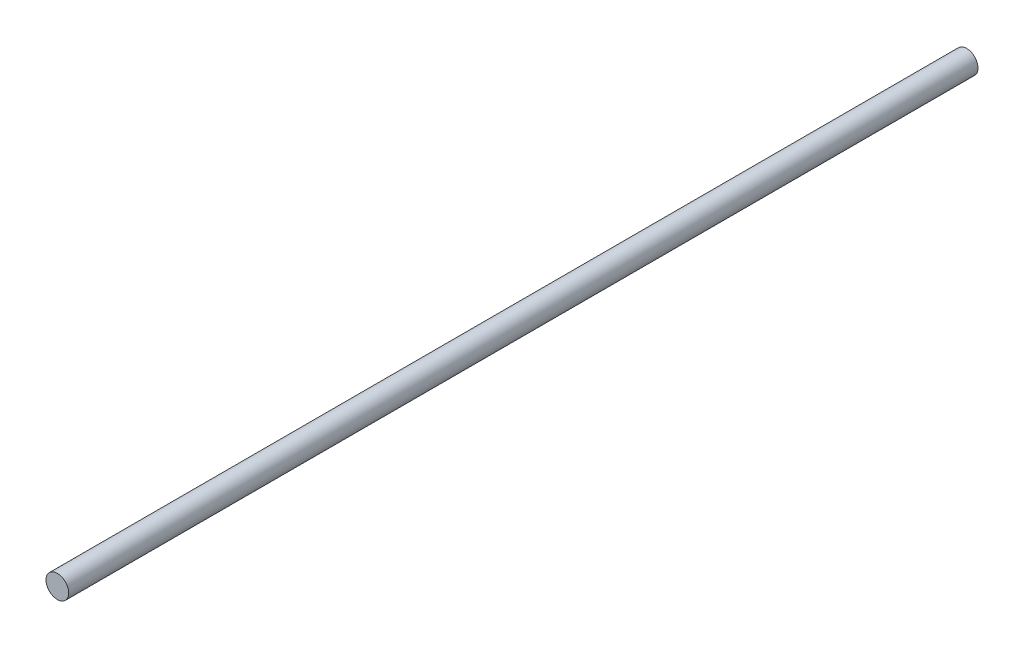
ISO-10303-21;
HEADER;
FILE_DESCRIPTION(('STEP AP214'),'2;1');
FILE_NAME('part.step','',(''),(''),'','','');
FILE_SCHEMA(('AUTOMOTIVE_DESIGN { 1 0 10303 214 1 1 1 1 }'));
ENDSEC;
DATA;
#1=APPLICATION_CONTEXT('core data for automotive mechanical design processes');
#2=APPLICATION_PROTOCOL_DEFINITION('international standard','automotive_design',2000,#1);
#3=PRODUCT_CONTEXT('',#1,'mechanical');
#4=PRODUCT('Part','Part','',(#3));
#5=PRODUCT_RELATED_PRODUCT_CATEGORY('part','',(#4));
#6=PRODUCT_DEFINITION_FORMATION('','',#4);
#7=PRODUCT_DEFINITION_CONTEXT('part definition',#1,'design');
#8=PRODUCT_DEFINITION('design','',#6,#7);
#9=PRODUCT_DEFINITION_SHAPE('','',#8);
#10=(LENGTH_UNIT() NAMED_UNIT(*) SI_UNIT(.MILLI.,.METRE.));
#11=(NAMED_UNIT(*) PLANE_ANGLE_UNIT() SI_UNIT($,.RADIAN.));
#12=(NAMED_UNIT(*) SI_UNIT($,.STERADIAN.) SOLID_ANGLE_UNIT());
#13=UNCERTAINTY_MEASURE_WITH_UNIT(LENGTH_MEASURE(1.E-05),#10,'distance_accuracy_value','');
#14=(GEOMETRIC_REPRESENTATION_CONTEXT(3) GLOBAL_UNCERTAINTY_ASSIGNED_CONTEXT((#13)) GLOBAL_UNIT_ASSIGNED_CONTEXT((#10,
#11,#12)) REPRESENTATION_CONTEXT('',''));
#15=CARTESIAN_POINT('',(0.,0.,0.));
#16=DIRECTION('',(0.,0.,1.));
#17=DIRECTION('',(1.,0.,0.));
#18=AXIS2_PLACEMENT_3D('',#15,#16,#17);
#19=CARTESIAN_POINT('',(0.,0.,127.));
#20=DIRECTION('',(0.,0.,-1.));
#21=DIRECTION('',(-1.,0.,0.));
#22=AXIS2_PLACEMENT_3D('',#19,#20,#21);
#23=CYLINDRICAL_SURFACE('',#22,3.175);
#24=CARTESIAN_POINT('',(0.,0.,127.));
#25=DIRECTION('',(0.,0.,1.));
#26=DIRECTION('',(1.,0.,0.));
#27=AXIS2_PLACEMENT_3D('',#24,#25,#26);
#28=CIRCLE('',#27,3.175);
#29=CARTESIAN_POINT('',(3.175,0.,127.));
#30=VERTEX_POINT('',#29);
#31=EDGE_CURVE('E10',#30,#30,#28,.T.);
#32=ORIENTED_EDGE('',*,*,#31,.F.);
#33=EDGE_LOOP('',(#32));
#34=FACE_BOUND('',#33,.T.);
#35=CARTESIAN_POINT('',(0.,0.,-127.));
#36=DIRECTION('',(0.,0.,1.));
#37=DIRECTION('',(1.,0.,0.));
#38=AXIS2_PLACEMENT_3D('',#35,#36,#37);
#39=CIRCLE('',#38,3.175);
#40=CARTESIAN_POINT('',(3.175,0.,-127.));
#41=VERTEX_POINT('',#40);
#42=EDGE_CURVE('E37',#41,#41,#39,.T.);
#43=ORIENTED_EDGE('',*,*,#42,.T.);
#44=EDGE_LOOP('',(#43));
#45=FACE_BOUND('',#44,.T.);
#46=ADVANCED_FACE('F34',(#34,#45),#23,.T.);
#47=CARTESIAN_POINT('',(0.,0.,127.));
#48=DIRECTION('',(0.,0.,1.));
#49=DIRECTION('',(1.,0.,0.));
#50=AXIS2_PLACEMENT_3D('',#47,#48,#49);
#51=PLANE('',#50);
#52=ORIENTED_EDGE('',*,*,#31,.T.);
#53=EDGE_LOOP('',(#52));
#54=FACE_BOUND('',#53,.T.);
#55=ADVANCED_FACE('F49',(#54),#51,.T.);
#56=CARTESIAN_POINT('',(0.,0.,-127.));
#57=DIRECTION('',(0.,0.,1.));
#58=DIRECTION('',(1.,0.,0.));
#59=AXIS2_PLACEMENT_3D('',#56,#57,#58);
#60=PLANE('',#59);
#61=ORIENTED_EDGE('',*,*,#42,.F.);
#62=EDGE_LOOP('',(#61));
#63=FACE_BOUND('',#62,.T.);
#64=ADVANCED_FACE('F47',(#63),#60,.F.);
#65=CLOSED_SHELL('',(#46,#55,#64));
#66=MANIFOLD_SOLID_BREP('B2',#65);
#67=ADVANCED_BREP_SHAPE_REPRESENTATION('',(#18,#66),#14);
#68=SHAPE_DEFINITION_REPRESENTATION(#9,#67);
ENDSEC;
END-ISO-10303-21;
